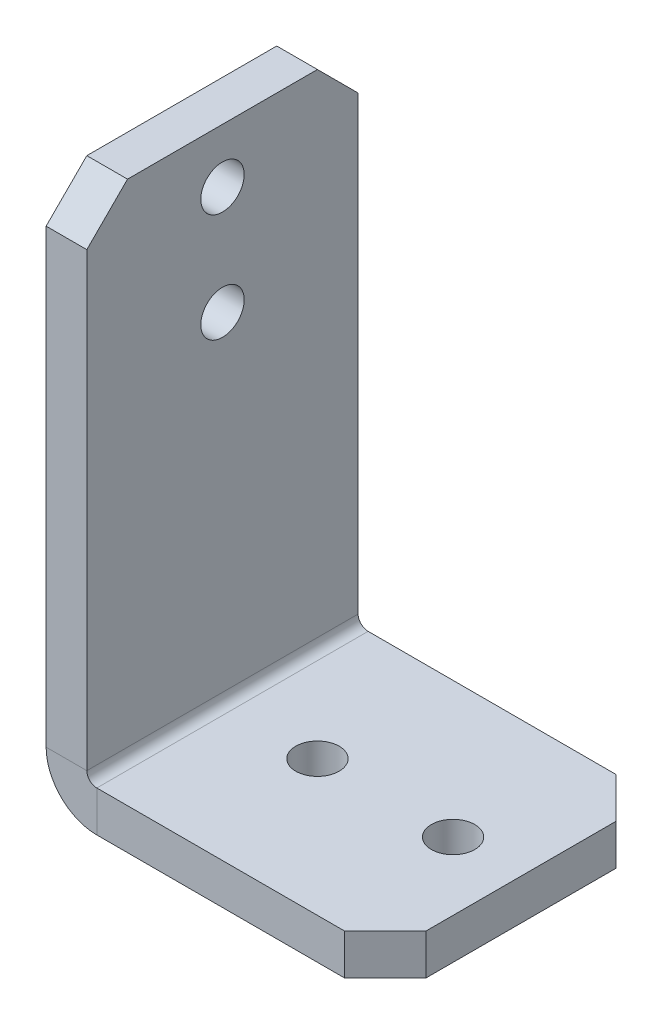
ISO-10303-21;
HEADER;
FILE_DESCRIPTION(('STEP AP214'),'2;1');
FILE_NAME('part.step','',(''),(''),'','','');
FILE_SCHEMA(('AUTOMOTIVE_DESIGN { 1 0 10303 214 1 1 1 1 }'));
ENDSEC;
DATA;
#1=APPLICATION_CONTEXT('core data for automotive mechanical design processes');
#2=APPLICATION_PROTOCOL_DEFINITION('international standard','automotive_design',2000,#1);
#3=PRODUCT_CONTEXT('',#1,'mechanical');
#4=PRODUCT('Part','Part','',(#3));
#5=PRODUCT_RELATED_PRODUCT_CATEGORY('part','',(#4));
#6=PRODUCT_DEFINITION_FORMATION('','',#4);
#7=PRODUCT_DEFINITION_CONTEXT('part definition',#1,'design');
#8=PRODUCT_DEFINITION('design','',#6,#7);
#9=PRODUCT_DEFINITION_SHAPE('','',#8);
#10=(LENGTH_UNIT() NAMED_UNIT(*) SI_UNIT(.MILLI.,.METRE.));
#11=(NAMED_UNIT(*) PLANE_ANGLE_UNIT() SI_UNIT($,.RADIAN.));
#12=(NAMED_UNIT(*) SI_UNIT($,.STERADIAN.) SOLID_ANGLE_UNIT());
#13=UNCERTAINTY_MEASURE_WITH_UNIT(LENGTH_MEASURE(1.E-05),#10,'distance_accuracy_value','');
#14=(GEOMETRIC_REPRESENTATION_CONTEXT(3) GLOBAL_UNCERTAINTY_ASSIGNED_CONTEXT((#13)) GLOBAL_UNIT_ASSIGNED_CONTEXT((#10,
#11,#12)) REPRESENTATION_CONTEXT('',''));
#15=CARTESIAN_POINT('',(0.,0.,0.));
#16=DIRECTION('',(0.,0.,1.));
#17=DIRECTION('',(1.,0.,0.));
#18=AXIS2_PLACEMENT_3D('',#15,#16,#17);
#19=CARTESIAN_POINT('',(0.,3.7366,20.));
#20=DIRECTION('',(0.,0.,1.));
#21=DIRECTION('',(1.,0.,0.));
#22=AXIS2_PLACEMENT_3D('',#19,#20,#21);
#23=PLANE('',#22);
#24=DIRECTION('',(1.,0.,0.));
#25=VECTOR('',#24,1.);
#26=CARTESIAN_POINT('',(0.,3.7366,20.));
#27=LINE('',#26,#25);
#28=CARTESIAN_POINT('',(0.,3.7366,20.));
#29=VERTEX_POINT('',#28);
#30=CARTESIAN_POINT('',(3.,3.7366,20.));
#31=VERTEX_POINT('',#30);
#32=EDGE_CURVE('E137',#29,#31,#27,.T.);
#33=ORIENTED_EDGE('',*,*,#32,.F.);
#34=CARTESIAN_POINT('',(3.7366,3.7366,20.));
#35=DIRECTION('',(0.,0.,1.));
#36=DIRECTION('',(1.,0.,0.));
#37=AXIS2_PLACEMENT_3D('',#34,#35,#36);
#38=CIRCLE('',#37,3.7366);
#39=CARTESIAN_POINT('',(3.7366,0.,20.));
#40=VERTEX_POINT('',#39);
#41=EDGE_CURVE('E141',#40,#29,#38,.F.);
#42=ORIENTED_EDGE('',*,*,#41,.F.);
#43=DIRECTION('',(0.,-1.,0.));
#44=VECTOR('',#43,1.);
#45=CARTESIAN_POINT('',(3.7366,3.,20.));
#46=LINE('',#45,#44);
#47=CARTESIAN_POINT('',(3.7366,3.,20.));
#48=VERTEX_POINT('',#47);
#49=EDGE_CURVE('E146',#48,#40,#46,.T.);
#50=ORIENTED_EDGE('',*,*,#49,.F.);
#51=CARTESIAN_POINT('',(3.7366,3.7366,20.));
#52=DIRECTION('',(0.,0.,1.));
#53=DIRECTION('',(1.,0.,0.));
#54=AXIS2_PLACEMENT_3D('',#51,#52,#53);
#55=CIRCLE('',#54,0.7366);
#56=EDGE_CURVE('E143',#48,#31,#55,.F.);
#57=ORIENTED_EDGE('',*,*,#56,.T.);
#58=EDGE_LOOP('',(#33,#42,#50,#57));
#59=FACE_BOUND('',#58,.T.);
#60=ADVANCED_FACE('F41',(#59),#23,.T.);
#61=CARTESIAN_POINT('',(3.7366,3.,20.));
#62=DIRECTION('',(0.,0.,1.));
#63=DIRECTION('',(1.,0.,0.));
#64=AXIS2_PLACEMENT_3D('',#61,#62,#63);
#65=PLANE('',#64);
#66=DIRECTION('',(0.,1.,0.));
#67=VECTOR('',#66,1.);
#68=CARTESIAN_POINT('',(3.,0.,20.));
#69=LINE('',#68,#67);
#70=CARTESIAN_POINT('',(3.,37.,20.));
#71=VERTEX_POINT('',#70);
#72=EDGE_CURVE('E161',#31,#71,#69,.T.);
#73=ORIENTED_EDGE('',*,*,#72,.T.);
#74=DIRECTION('',(-1.,0.,0.));
#75=VECTOR('',#74,1.);
#76=CARTESIAN_POINT('',(3.7366,37.,20.));
#77=LINE('',#76,#75);
#78=CARTESIAN_POINT('',(0.,37.,20.));
#79=VERTEX_POINT('',#78);
#80=EDGE_CURVE('E67',#71,#79,#77,.T.);
#81=ORIENTED_EDGE('',*,*,#80,.T.);
#82=DIRECTION('',(0.,1.,0.));
#83=VECTOR('',#82,1.);
#84=CARTESIAN_POINT('',(0.,0.,20.));
#85=LINE('',#84,#83);
#86=EDGE_CURVE('E151',#29,#79,#85,.T.);
#87=ORIENTED_EDGE('',*,*,#86,.F.);
#88=ORIENTED_EDGE('',*,*,#32,.T.);
#89=EDGE_LOOP('',(#73,#81,#87,#88));
#90=FACE_BOUND('',#89,.T.);
#91=ADVANCED_FACE('F160',(#90),#65,.T.);
#92=CARTESIAN_POINT('',(3.7366,0.,0.));
#93=DIRECTION('',(0.,0.,-1.));
#94=DIRECTION('',(-1.,0.,0.));
#95=AXIS2_PLACEMENT_3D('',#92,#93,#94);
#96=PLANE('',#95);
#97=DIRECTION('',(0.,1.,0.));
#98=VECTOR('',#97,1.);
#99=CARTESIAN_POINT('',(3.7366,0.,0.));
#100=LINE('',#99,#98);
#101=CARTESIAN_POINT('',(3.7366,0.,0.));
#102=VERTEX_POINT('',#101);
#103=CARTESIAN_POINT('',(3.7366,3.,0.));
#104=VERTEX_POINT('',#103);
#105=EDGE_CURVE('E207',#102,#104,#100,.T.);
#106=ORIENTED_EDGE('',*,*,#105,.F.);
#107=CARTESIAN_POINT('',(3.7366,3.7366,0.));
#108=DIRECTION('',(0.,0.,1.));
#109=DIRECTION('',(1.,0.,0.));
#110=AXIS2_PLACEMENT_3D('',#107,#108,#109);
#111=CIRCLE('',#110,3.7366);
#112=CARTESIAN_POINT('',(0.,3.7366,0.));
#113=VERTEX_POINT('',#112);
#114=EDGE_CURVE('E180',#102,#113,#111,.F.);
#115=ORIENTED_EDGE('',*,*,#114,.T.);
#116=DIRECTION('',(-1.,0.,0.));
#117=VECTOR('',#116,1.);
#118=CARTESIAN_POINT('',(3.,3.7366,0.));
#119=LINE('',#118,#117);
#120=CARTESIAN_POINT('',(3.,3.7366,0.));
#121=VERTEX_POINT('',#120);
#122=EDGE_CURVE('E205',#121,#113,#119,.T.);
#123=ORIENTED_EDGE('',*,*,#122,.F.);
#124=CARTESIAN_POINT('',(3.7366,3.7366,0.));
#125=DIRECTION('',(0.,0.,1.));
#126=DIRECTION('',(1.,0.,0.));
#127=AXIS2_PLACEMENT_3D('',#124,#125,#126);
#128=CIRCLE('',#127,0.7366);
#129=EDGE_CURVE('E186',#104,#121,#128,.F.);
#130=ORIENTED_EDGE('',*,*,#129,.F.);
#131=EDGE_LOOP('',(#106,#115,#123,#130));
#132=FACE_BOUND('',#131,.T.);
#133=ADVANCED_FACE('F274',(#132),#96,.T.);
#134=CARTESIAN_POINT('',(3.,3.7366,0.));
#135=DIRECTION('',(0.,0.,-1.));
#136=DIRECTION('',(-1.,0.,0.));
#137=AXIS2_PLACEMENT_3D('',#134,#135,#136);
#138=PLANE('',#137);
#139=DIRECTION('',(1.,0.,0.));
#140=VECTOR('',#139,1.);
#141=CARTESIAN_POINT('',(0.,3.,0.));
#142=LINE('',#141,#140);
#143=CARTESIAN_POINT('',(22.,3.,0.));
#144=VERTEX_POINT('',#143);
#145=EDGE_CURVE('E184',#144,#104,#142,.F.);
#146=ORIENTED_EDGE('',*,*,#145,.F.);
#147=DIRECTION('',(0.,-1.,0.));
#148=VECTOR('',#147,1.);
#149=CARTESIAN_POINT('',(22.,3.7366,0.));
#150=LINE('',#149,#148);
#151=CARTESIAN_POINT('',(22.,0.,0.));
#152=VERTEX_POINT('',#151);
#153=EDGE_CURVE('E145',#144,#152,#150,.T.);
#154=ORIENTED_EDGE('',*,*,#153,.T.);
#155=DIRECTION('',(-1.,0.,0.));
#156=VECTOR('',#155,1.);
#157=CARTESIAN_POINT('',(0.,0.,0.));
#158=LINE('',#157,#156);
#159=EDGE_CURVE('E182',#152,#102,#158,.T.);
#160=ORIENTED_EDGE('',*,*,#159,.T.);
#161=ORIENTED_EDGE('',*,*,#105,.T.);
#162=EDGE_LOOP('',(#146,#154,#160,#161));
#163=FACE_BOUND('',#162,.T.);
#164=ADVANCED_FACE('F291',(#163),#138,.T.);
#165=CARTESIAN_POINT('',(3.,0.,20.));
#166=DIRECTION('',(-1.,0.,0.));
#167=DIRECTION('',(0.,0.,1.));
#168=AXIS2_PLACEMENT_3D('',#165,#166,#167);
#169=PLANE('',#168);
#170=CARTESIAN_POINT('',(3.,28.,10.));
#171=DIRECTION('',(-1.,0.,0.));
#172=DIRECTION('',(0.,0.,1.));
#173=AXIS2_PLACEMENT_3D('',#170,#171,#172);
#174=CIRCLE('',#173,1.6);
#175=CARTESIAN_POINT('',(3.,28.,11.6));
#176=VERTEX_POINT('',#175);
#177=EDGE_CURVE('E376',#176,#176,#174,.T.);
#178=ORIENTED_EDGE('',*,*,#177,.T.);
#179=EDGE_LOOP('',(#178));
#180=FACE_BOUND('',#179,.T.);
#181=CARTESIAN_POINT('',(3.,36.,10.));
#182=DIRECTION('',(-1.,0.,0.));
#183=DIRECTION('',(0.,0.,1.));
#184=AXIS2_PLACEMENT_3D('',#181,#182,#183);
#185=CIRCLE('',#184,1.6);
#186=CARTESIAN_POINT('',(3.,36.,11.6));
#187=VERTEX_POINT('',#186);
#188=EDGE_CURVE('E380',#187,#187,#185,.T.);
#189=ORIENTED_EDGE('',*,*,#188,.T.);
#190=EDGE_LOOP('',(#189));
#191=FACE_BOUND('',#190,.T.);
#192=DIRECTION('',(0.,0.,-1.));
#193=VECTOR('',#192,1.);
#194=CARTESIAN_POINT('',(3.,40.,20.));
#195=LINE('',#194,#193);
#196=CARTESIAN_POINT('',(3.,40.,17.));
#197=VERTEX_POINT('',#196);
#198=CARTESIAN_POINT('',(3.,40.,3.00000000000002));
#199=VERTEX_POINT('',#198);
#200=EDGE_CURVE('E202',#197,#199,#195,.T.);
#201=ORIENTED_EDGE('',*,*,#200,.F.);
#202=DIRECTION('',(0.,0.707106781186548,-0.707106781186547));
#203=VECTOR('',#202,1.);
#204=CARTESIAN_POINT('',(3.,40.,17.));
#205=LINE('',#204,#203);
#206=EDGE_CURVE('E236',#197,#71,#205,.F.);
#207=ORIENTED_EDGE('',*,*,#206,.T.);
#208=ORIENTED_EDGE('',*,*,#72,.F.);
#209=DIRECTION('',(0.,0.,-1.));
#210=VECTOR('',#209,1.);
#211=CARTESIAN_POINT('',(3.,3.7366,20.));
#212=LINE('',#211,#210);
#213=EDGE_CURVE('E174',#31,#121,#212,.T.);
#214=ORIENTED_EDGE('',*,*,#213,.T.);
#215=DIRECTION('',(0.,1.,0.));
#216=VECTOR('',#215,1.);
#217=CARTESIAN_POINT('',(3.,0.,0.));
#218=LINE('',#217,#216);
#219=CARTESIAN_POINT('',(3.,37.,0.));
#220=VERTEX_POINT('',#219);
#221=EDGE_CURVE('E175',#121,#220,#218,.T.);
#222=ORIENTED_EDGE('',*,*,#221,.T.);
#223=DIRECTION('',(0.,0.707106781186546,0.707106781186549));
#224=VECTOR('',#223,1.);
#225=CARTESIAN_POINT('',(3.,37.,0.));
#226=LINE('',#225,#224);
#227=EDGE_CURVE('E234',#220,#199,#226,.T.);
#228=ORIENTED_EDGE('',*,*,#227,.T.);
#229=EDGE_LOOP('',(#201,#207,#208,#214,#222,#228));
#230=FACE_BOUND('',#229,.T.);
#231=ADVANCED_FACE('F267',(#180,#191,#230),#169,.F.);
#232=CARTESIAN_POINT('',(0.,40.,20.));
#233=DIRECTION('',(0.,1.,0.));
#234=DIRECTION('',(0.,0.,1.));
#235=AXIS2_PLACEMENT_3D('',#232,#233,#234);
#236=PLANE('',#235);
#237=DIRECTION('',(0.,0.,-1.));
#238=VECTOR('',#237,1.);
#239=CARTESIAN_POINT('',(0.,40.,20.));
#240=LINE('',#239,#238);
#241=CARTESIAN_POINT('',(0.,40.,17.));
#242=VERTEX_POINT('',#241);
#243=CARTESIAN_POINT('',(0.,40.,3.00000000000002));
#244=VERTEX_POINT('',#243);
#245=EDGE_CURVE('E157',#242,#244,#240,.T.);
#246=ORIENTED_EDGE('',*,*,#245,.F.);
#247=DIRECTION('',(1.,0.,0.));
#248=VECTOR('',#247,1.);
#249=CARTESIAN_POINT('',(0.,40.,17.));
#250=LINE('',#249,#248);
#251=EDGE_CURVE('E231',#242,#197,#250,.T.);
#252=ORIENTED_EDGE('',*,*,#251,.T.);
#253=ORIENTED_EDGE('',*,*,#200,.T.);
#254=DIRECTION('',(-1.,0.,0.));
#255=VECTOR('',#254,1.);
#256=CARTESIAN_POINT('',(0.,40.,3.00000000000002));
#257=LINE('',#256,#255);
#258=EDGE_CURVE('E229',#199,#244,#257,.T.);
#259=ORIENTED_EDGE('',*,*,#258,.T.);
#260=EDGE_LOOP('',(#246,#252,#253,#259));
#261=FACE_BOUND('',#260,.T.);
#262=ADVANCED_FACE('F259',(#261),#236,.T.);
#263=CARTESIAN_POINT('',(0.,0.,20.));
#264=DIRECTION('',(-1.,0.,0.));
#265=DIRECTION('',(0.,0.,1.));
#266=AXIS2_PLACEMENT_3D('',#263,#264,#265);
#267=PLANE('',#266);
#268=CARTESIAN_POINT('',(0.,28.,10.));
#269=DIRECTION('',(-1.,0.,0.));
#270=DIRECTION('',(0.,0.,1.));
#271=AXIS2_PLACEMENT_3D('',#268,#269,#270);
#272=CIRCLE('',#271,1.6);
#273=CARTESIAN_POINT('',(0.,28.,11.6));
#274=VERTEX_POINT('',#273);
#275=EDGE_CURVE('E373',#274,#274,#272,.T.);
#276=ORIENTED_EDGE('',*,*,#275,.F.);
#277=EDGE_LOOP('',(#276));
#278=FACE_BOUND('',#277,.T.);
#279=CARTESIAN_POINT('',(0.,36.,10.));
#280=DIRECTION('',(-1.,0.,0.));
#281=DIRECTION('',(0.,0.,1.));
#282=AXIS2_PLACEMENT_3D('',#279,#280,#281);
#283=CIRCLE('',#282,1.6);
#284=CARTESIAN_POINT('',(0.,36.,11.6));
#285=VERTEX_POINT('',#284);
#286=EDGE_CURVE('E377',#285,#285,#283,.T.);
#287=ORIENTED_EDGE('',*,*,#286,.F.);
#288=EDGE_LOOP('',(#287));
#289=FACE_BOUND('',#288,.T.);
#290=ORIENTED_EDGE('',*,*,#86,.T.);
#291=DIRECTION('',(0.,-0.707106781186548,0.707106781186547));
#292=VECTOR('',#291,1.);
#293=CARTESIAN_POINT('',(0.,18.4999999999999,38.5));
#294=LINE('',#293,#292);
#295=EDGE_CURVE('E51',#79,#242,#294,.F.);
#296=ORIENTED_EDGE('',*,*,#295,.T.);
#297=ORIENTED_EDGE('',*,*,#245,.T.);
#298=DIRECTION('',(0.,-0.707106781186546,-0.707106781186549));
#299=VECTOR('',#298,1.);
#300=CARTESIAN_POINT('',(0.,28.5000000000001,-8.49999999999994));
#301=LINE('',#300,#299);
#302=CARTESIAN_POINT('',(0.,37.,0.));
#303=VERTEX_POINT('',#302);
#304=EDGE_CURVE('E59',#244,#303,#301,.T.);
#305=ORIENTED_EDGE('',*,*,#304,.T.);
#306=DIRECTION('',(0.,1.,0.));
#307=VECTOR('',#306,1.);
#308=CARTESIAN_POINT('',(0.,0.,0.));
#309=LINE('',#308,#307);
#310=EDGE_CURVE('E153',#113,#303,#309,.T.);
#311=ORIENTED_EDGE('',*,*,#310,.F.);
#312=DIRECTION('',(0.,0.,-1.));
#313=VECTOR('',#312,1.);
#314=CARTESIAN_POINT('',(0.,3.7366,20.));
#315=LINE('',#314,#313);
#316=EDGE_CURVE('E149',#29,#113,#315,.T.);
#317=ORIENTED_EDGE('',*,*,#316,.F.);
#318=EDGE_LOOP('',(#290,#296,#297,#305,#311,#317));
#319=FACE_BOUND('',#318,.T.);
#320=ADVANCED_FACE('F150',(#278,#289,#319),#267,.T.);
#321=CARTESIAN_POINT('',(3.7366,3.7366,20.));
#322=DIRECTION('',(0.,0.,-1.));
#323=DIRECTION('',(-1.,0.,0.));
#324=AXIS2_PLACEMENT_3D('',#321,#322,#323);
#325=CYLINDRICAL_SURFACE('',#324,3.7366);
#326=ORIENTED_EDGE('',*,*,#114,.F.);
#327=DIRECTION('',(0.,0.,-1.));
#328=VECTOR('',#327,1.);
#329=CARTESIAN_POINT('',(3.7366,0.,20.));
#330=LINE('',#329,#328);
#331=EDGE_CURVE('E158',#40,#102,#330,.T.);
#332=ORIENTED_EDGE('',*,*,#331,.F.);
#333=ORIENTED_EDGE('',*,*,#41,.T.);
#334=ORIENTED_EDGE('',*,*,#316,.T.);
#335=EDGE_LOOP('',(#326,#332,#333,#334));
#336=FACE_BOUND('',#335,.T.);
#337=ADVANCED_FACE('F164',(#336),#325,.T.);
#338=CARTESIAN_POINT('',(0.,0.,20.));
#339=DIRECTION('',(0.,-1.,0.));
#340=DIRECTION('',(0.,0.,-1.));
#341=AXIS2_PLACEMENT_3D('',#338,#339,#340);
#342=PLANE('',#341);
#343=CARTESIAN_POINT('',(10.,0.,10.));
#344=DIRECTION('',(0.,-1.,0.));
#345=DIRECTION('',(0.,0.,-1.));
#346=AXIS2_PLACEMENT_3D('',#343,#344,#345);
#347=CIRCLE('',#346,1.6);
#348=CARTESIAN_POINT('',(10.,0.,8.4));
#349=VERTEX_POINT('',#348);
#350=EDGE_CURVE('E249',#349,#349,#347,.T.);
#351=ORIENTED_EDGE('',*,*,#350,.F.);
#352=EDGE_LOOP('',(#351));
#353=FACE_BOUND('',#352,.T.);
#354=CARTESIAN_POINT('',(20.,0.,10.));
#355=DIRECTION('',(0.,-1.,0.));
#356=DIRECTION('',(0.,0.,-1.));
#357=AXIS2_PLACEMENT_3D('',#354,#355,#356);
#358=CIRCLE('',#357,1.6);
#359=CARTESIAN_POINT('',(20.,0.,8.4));
#360=VERTEX_POINT('',#359);
#361=EDGE_CURVE('E241',#360,#360,#358,.T.);
#362=ORIENTED_EDGE('',*,*,#361,.F.);
#363=EDGE_LOOP('',(#362));
#364=FACE_BOUND('',#363,.T.);
#365=ORIENTED_EDGE('',*,*,#159,.F.);
#366=DIRECTION('',(-0.707106781186547,0.,-0.707106781186548));
#367=VECTOR('',#366,1.);
#368=CARTESIAN_POINT('',(21.,0.,-0.999999999999973));
#369=LINE('',#368,#367);
#370=CARTESIAN_POINT('',(25.,0.,3.00000000000001));
#371=VERTEX_POINT('',#370);
#372=EDGE_CURVE('E216',#152,#371,#369,.F.);
#373=ORIENTED_EDGE('',*,*,#372,.T.);
#374=DIRECTION('',(0.,0.,-1.));
#375=VECTOR('',#374,1.);
#376=CARTESIAN_POINT('',(25.,0.,20.));
#377=LINE('',#376,#375);
#378=CARTESIAN_POINT('',(25.,0.,17.));
#379=VERTEX_POINT('',#378);
#380=EDGE_CURVE('E197',#379,#371,#377,.T.);
#381=ORIENTED_EDGE('',*,*,#380,.F.);
#382=DIRECTION('',(0.707106781186548,0.,-0.707106781186547));
#383=VECTOR('',#382,1.);
#384=CARTESIAN_POINT('',(11.,0.,31.));
#385=LINE('',#384,#383);
#386=CARTESIAN_POINT('',(22.,0.,20.));
#387=VERTEX_POINT('',#386);
#388=EDGE_CURVE('E214',#379,#387,#385,.F.);
#389=ORIENTED_EDGE('',*,*,#388,.T.);
#390=DIRECTION('',(-1.,0.,0.));
#391=VECTOR('',#390,1.);
#392=CARTESIAN_POINT('',(0.,0.,20.));
#393=LINE('',#392,#391);
#394=EDGE_CURVE('E166',#387,#40,#393,.T.);
#395=ORIENTED_EDGE('',*,*,#394,.T.);
#396=ORIENTED_EDGE('',*,*,#331,.T.);
#397=EDGE_LOOP('',(#365,#373,#381,#389,#395,#396));
#398=FACE_BOUND('',#397,.T.);
#399=ADVANCED_FACE('F279',(#353,#364,#398),#342,.T.);
#400=CARTESIAN_POINT('',(25.,3.,20.));
#401=DIRECTION('',(1.,0.,0.));
#402=DIRECTION('',(0.,0.,-1.));
#403=AXIS2_PLACEMENT_3D('',#400,#401,#402);
#404=PLANE('',#403);
#405=ORIENTED_EDGE('',*,*,#380,.T.);
#406=DIRECTION('',(0.,1.,0.));
#407=VECTOR('',#406,1.);
#408=CARTESIAN_POINT('',(25.,3.,3.00000000000001));
#409=LINE('',#408,#407);
#410=CARTESIAN_POINT('',(25.,3.,3.00000000000001));
#411=VERTEX_POINT('',#410);
#412=EDGE_CURVE('E221',#371,#411,#409,.T.);
#413=ORIENTED_EDGE('',*,*,#412,.T.);
#414=DIRECTION('',(0.,0.,-1.));
#415=VECTOR('',#414,1.);
#416=CARTESIAN_POINT('',(25.,3.,20.));
#417=LINE('',#416,#415);
#418=CARTESIAN_POINT('',(25.,3.,17.));
#419=VERTEX_POINT('',#418);
#420=EDGE_CURVE('E194',#419,#411,#417,.T.);
#421=ORIENTED_EDGE('',*,*,#420,.F.);
#422=DIRECTION('',(0.,-1.,0.));
#423=VECTOR('',#422,1.);
#424=CARTESIAN_POINT('',(25.,3.,17.));
#425=LINE('',#424,#423);
#426=EDGE_CURVE('E218',#419,#379,#425,.T.);
#427=ORIENTED_EDGE('',*,*,#426,.T.);
#428=EDGE_LOOP('',(#405,#413,#421,#427));
#429=FACE_BOUND('',#428,.T.);
#430=ADVANCED_FACE('F296',(#429),#404,.T.);
#431=CARTESIAN_POINT('',(0.,3.,20.));
#432=DIRECTION('',(0.,-1.,0.));
#433=DIRECTION('',(0.,0.,-1.));
#434=AXIS2_PLACEMENT_3D('',#431,#432,#433);
#435=PLANE('',#434);
#436=CARTESIAN_POINT('',(10.,3.,10.));
#437=DIRECTION('',(0.,-1.,0.));
#438=DIRECTION('',(0.,0.,-1.));
#439=AXIS2_PLACEMENT_3D('',#436,#437,#438);
#440=CIRCLE('',#439,1.6);
#441=CARTESIAN_POINT('',(10.,3.,8.4));
#442=VERTEX_POINT('',#441);
#443=EDGE_CURVE('E46',#442,#442,#440,.T.);
#444=ORIENTED_EDGE('',*,*,#443,.T.);
#445=EDGE_LOOP('',(#444));
#446=FACE_BOUND('',#445,.T.);
#447=CARTESIAN_POINT('',(20.,3.,10.));
#448=DIRECTION('',(0.,-1.,0.));
#449=DIRECTION('',(0.,0.,-1.));
#450=AXIS2_PLACEMENT_3D('',#447,#448,#449);
#451=CIRCLE('',#450,1.6);
#452=CARTESIAN_POINT('',(20.,3.,8.4));
#453=VERTEX_POINT('',#452);
#454=EDGE_CURVE('E178',#453,#453,#451,.T.);
#455=ORIENTED_EDGE('',*,*,#454,.T.);
#456=EDGE_LOOP('',(#455));
#457=FACE_BOUND('',#456,.T.);
#458=ORIENTED_EDGE('',*,*,#420,.T.);
#459=DIRECTION('',(0.707106781186547,0.,0.707106781186548));
#460=VECTOR('',#459,1.);
#461=CARTESIAN_POINT('',(22.,3.,0.));
#462=LINE('',#461,#460);
#463=EDGE_CURVE('E225',#411,#144,#462,.F.);
#464=ORIENTED_EDGE('',*,*,#463,.T.);
#465=ORIENTED_EDGE('',*,*,#145,.T.);
#466=DIRECTION('',(0.,0.,-1.));
#467=VECTOR('',#466,1.);
#468=CARTESIAN_POINT('',(3.7366,3.,20.));
#469=LINE('',#468,#467);
#470=EDGE_CURVE('E191',#48,#104,#469,.T.);
#471=ORIENTED_EDGE('',*,*,#470,.F.);
#472=DIRECTION('',(1.,0.,0.));
#473=VECTOR('',#472,1.);
#474=CARTESIAN_POINT('',(0.,3.,20.));
#475=LINE('',#474,#473);
#476=CARTESIAN_POINT('',(22.,3.,20.));
#477=VERTEX_POINT('',#476);
#478=EDGE_CURVE('E168',#477,#48,#475,.F.);
#479=ORIENTED_EDGE('',*,*,#478,.F.);
#480=DIRECTION('',(-0.707106781186548,0.,0.707106781186547));
#481=VECTOR('',#480,1.);
#482=CARTESIAN_POINT('',(25.,3.,17.));
#483=LINE('',#482,#481);
#484=EDGE_CURVE('E223',#477,#419,#483,.F.);
#485=ORIENTED_EDGE('',*,*,#484,.T.);
#486=EDGE_LOOP('',(#458,#464,#465,#471,#479,#485));
#487=FACE_BOUND('',#486,.T.);
#488=ADVANCED_FACE('F287',(#446,#457,#487),#435,.F.);
#489=CARTESIAN_POINT('',(3.7366,3.7366,20.));
#490=DIRECTION('',(0.,0.,-1.));
#491=DIRECTION('',(-1.,0.,0.));
#492=AXIS2_PLACEMENT_3D('',#489,#490,#491);
#493=CYLINDRICAL_SURFACE('',#492,0.7366);
#494=ORIENTED_EDGE('',*,*,#129,.T.);
#495=ORIENTED_EDGE('',*,*,#213,.F.);
#496=ORIENTED_EDGE('',*,*,#56,.F.);
#497=ORIENTED_EDGE('',*,*,#470,.T.);
#498=EDGE_LOOP('',(#494,#495,#496,#497));
#499=FACE_BOUND('',#498,.T.);
#500=ADVANCED_FACE('F269',(#499),#493,.F.);
#501=CARTESIAN_POINT('',(3.7366,3.7366,20.));
#502=DIRECTION('',(0.,0.,1.));
#503=DIRECTION('',(1.,0.,0.));
#504=AXIS2_PLACEMENT_3D('',#501,#502,#503);
#505=PLANE('',#504);
#506=ORIENTED_EDGE('',*,*,#394,.F.);
#507=DIRECTION('',(0.,1.,0.));
#508=VECTOR('',#507,1.);
#509=CARTESIAN_POINT('',(22.,3.7366,20.));
#510=LINE('',#509,#508);
#511=EDGE_CURVE('E227',#387,#477,#510,.T.);
#512=ORIENTED_EDGE('',*,*,#511,.T.);
#513=ORIENTED_EDGE('',*,*,#478,.T.);
#514=ORIENTED_EDGE('',*,*,#49,.T.);
#515=EDGE_LOOP('',(#506,#512,#513,#514));
#516=FACE_BOUND('',#515,.T.);
#517=ADVANCED_FACE('F284',(#516),#505,.T.);
#518=CARTESIAN_POINT('',(3.7366,3.7366,0.));
#519=DIRECTION('',(0.,0.,1.));
#520=DIRECTION('',(1.,0.,0.));
#521=AXIS2_PLACEMENT_3D('',#518,#519,#520);
#522=PLANE('',#521);
#523=ORIENTED_EDGE('',*,*,#310,.T.);
#524=DIRECTION('',(1.,0.,0.));
#525=VECTOR('',#524,1.);
#526=CARTESIAN_POINT('',(3.,37.,0.));
#527=LINE('',#526,#525);
#528=EDGE_CURVE('E11',#303,#220,#527,.T.);
#529=ORIENTED_EDGE('',*,*,#528,.T.);
#530=ORIENTED_EDGE('',*,*,#221,.F.);
#531=ORIENTED_EDGE('',*,*,#122,.T.);
#532=EDGE_LOOP('',(#523,#529,#530,#531));
#533=FACE_BOUND('',#532,.T.);
#534=ADVANCED_FACE('F266',(#533),#522,.F.);
#535=CARTESIAN_POINT('',(22.,3.7366,0.));
#536=DIRECTION('',(-0.707106781186548,0.,0.707106781186547));
#537=DIRECTION('',(0.,-1.,0.));
#538=AXIS2_PLACEMENT_3D('',#535,#536,#537);
#539=PLANE('',#538);
#540=ORIENTED_EDGE('',*,*,#463,.F.);
#541=ORIENTED_EDGE('',*,*,#412,.F.);
#542=ORIENTED_EDGE('',*,*,#372,.F.);
#543=ORIENTED_EDGE('',*,*,#153,.F.);
#544=EDGE_LOOP('',(#540,#541,#542,#543));
#545=FACE_BOUND('',#544,.T.);
#546=ADVANCED_FACE('F293',(#545),#539,.F.);
#547=CARTESIAN_POINT('',(25.,3.,17.));
#548=DIRECTION('',(-0.707106781186547,0.,-0.707106781186548));
#549=DIRECTION('',(0.,-1.,0.));
#550=AXIS2_PLACEMENT_3D('',#547,#548,#549);
#551=PLANE('',#550);
#552=ORIENTED_EDGE('',*,*,#484,.F.);
#553=ORIENTED_EDGE('',*,*,#511,.F.);
#554=ORIENTED_EDGE('',*,*,#388,.F.);
#555=ORIENTED_EDGE('',*,*,#426,.F.);
#556=EDGE_LOOP('',(#552,#553,#554,#555));
#557=FACE_BOUND('',#556,.T.);
#558=ADVANCED_FACE('F300',(#557),#551,.F.);
#559=CARTESIAN_POINT('',(0.,40.,17.));
#560=DIRECTION('',(0.,-0.707106781186547,-0.707106781186548));
#561=DIRECTION('',(1.,0.,0.));
#562=AXIS2_PLACEMENT_3D('',#559,#560,#561);
#563=PLANE('',#562);
#564=ORIENTED_EDGE('',*,*,#295,.F.);
#565=ORIENTED_EDGE('',*,*,#80,.F.);
#566=ORIENTED_EDGE('',*,*,#206,.F.);
#567=ORIENTED_EDGE('',*,*,#251,.F.);
#568=EDGE_LOOP('',(#564,#565,#566,#567));
#569=FACE_BOUND('',#568,.T.);
#570=ADVANCED_FACE('F255',(#569),#563,.F.);
#571=CARTESIAN_POINT('',(3.7366,37.,0.));
#572=DIRECTION('',(0.,0.707106781186549,-0.707106781186546));
#573=DIRECTION('',(-1.,0.,0.));
#574=AXIS2_PLACEMENT_3D('',#571,#572,#573);
#575=PLANE('',#574);
#576=ORIENTED_EDGE('',*,*,#304,.F.);
#577=ORIENTED_EDGE('',*,*,#258,.F.);
#578=ORIENTED_EDGE('',*,*,#227,.F.);
#579=ORIENTED_EDGE('',*,*,#528,.F.);
#580=EDGE_LOOP('',(#576,#577,#578,#579));
#581=FACE_BOUND('',#580,.T.);
#582=ADVANCED_FACE('F44',(#581),#575,.T.);
#583=CARTESIAN_POINT('',(20.,40.,10.));
#584=DIRECTION('',(0.,-1.,0.));
#585=DIRECTION('',(0.,0.,-1.));
#586=AXIS2_PLACEMENT_3D('',#583,#584,#585);
#587=CYLINDRICAL_SURFACE('',#586,1.6);
#588=ORIENTED_EDGE('',*,*,#361,.T.);
#589=EDGE_LOOP('',(#588));
#590=FACE_BOUND('',#589,.T.);
#591=ORIENTED_EDGE('',*,*,#454,.F.);
#592=EDGE_LOOP('',(#591));
#593=FACE_BOUND('',#592,.T.);
#594=ADVANCED_FACE('F354',(#590,#593),#587,.F.);
#595=CARTESIAN_POINT('',(10.,40.,10.));
#596=DIRECTION('',(0.,-1.,0.));
#597=DIRECTION('',(0.,0.,-1.));
#598=AXIS2_PLACEMENT_3D('',#595,#596,#597);
#599=CYLINDRICAL_SURFACE('',#598,1.6);
#600=ORIENTED_EDGE('',*,*,#350,.T.);
#601=EDGE_LOOP('',(#600));
#602=FACE_BOUND('',#601,.T.);
#603=ORIENTED_EDGE('',*,*,#443,.F.);
#604=EDGE_LOOP('',(#603));
#605=FACE_BOUND('',#604,.T.);
#606=ADVANCED_FACE('F357',(#602,#605),#599,.F.);
#607=CARTESIAN_POINT('',(25.,36.,10.));
#608=DIRECTION('',(-1.,0.,0.));
#609=DIRECTION('',(0.,0.,1.));
#610=AXIS2_PLACEMENT_3D('',#607,#608,#609);
#611=CYLINDRICAL_SURFACE('',#610,1.6);
#612=ORIENTED_EDGE('',*,*,#286,.T.);
#613=EDGE_LOOP('',(#612));
#614=FACE_BOUND('',#613,.T.);
#615=ORIENTED_EDGE('',*,*,#188,.F.);
#616=EDGE_LOOP('',(#615));
#617=FACE_BOUND('',#616,.T.);
#618=ADVANCED_FACE('F360',(#614,#617),#611,.F.);
#619=CARTESIAN_POINT('',(25.,28.,10.));
#620=DIRECTION('',(-1.,0.,0.));
#621=DIRECTION('',(0.,0.,1.));
#622=AXIS2_PLACEMENT_3D('',#619,#620,#621);
#623=CYLINDRICAL_SURFACE('',#622,1.6);
#624=ORIENTED_EDGE('',*,*,#275,.T.);
#625=EDGE_LOOP('',(#624));
#626=FACE_BOUND('',#625,.T.);
#627=ORIENTED_EDGE('',*,*,#177,.F.);
#628=EDGE_LOOP('',(#627));
#629=FACE_BOUND('',#628,.T.);
#630=ADVANCED_FACE('F364',(#626,#629),#623,.F.);
#631=CLOSED_SHELL('',(#60,#91,#133,#164,#231,#262,#320,#337,#399,#430,#488,#500,#517,#534,#546,
#558,#570,#582,#594,#606,#618,#630));
#632=MANIFOLD_SOLID_BREP('B2',#631);
#633=ADVANCED_BREP_SHAPE_REPRESENTATION('',(#18,#632),#14);
#634=SHAPE_DEFINITION_REPRESENTATION(#9,#633);
ENDSEC;
END-ISO-10303-21;
